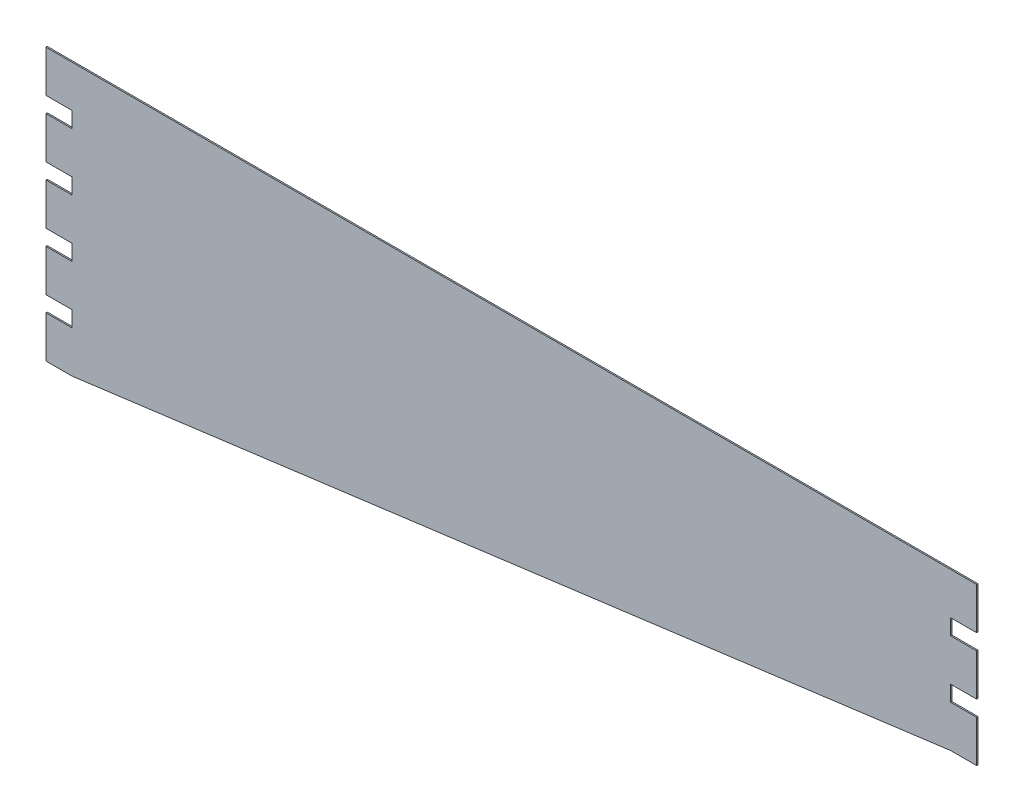
ISO-10303-21;
HEADER;
FILE_DESCRIPTION(('STEP AP214'),'2;1');
FILE_NAME('part.step','',(''),(''),'','','');
FILE_SCHEMA(('AUTOMOTIVE_DESIGN { 1 0 10303 214 1 1 1 1 }'));
ENDSEC;
DATA;
#1=APPLICATION_CONTEXT('core data for automotive mechanical design processes');
#2=APPLICATION_PROTOCOL_DEFINITION('international standard','automotive_design',2000,#1);
#3=PRODUCT_CONTEXT('',#1,'mechanical');
#4=PRODUCT('Part','Part','',(#3));
#5=PRODUCT_RELATED_PRODUCT_CATEGORY('part','',(#4));
#6=PRODUCT_DEFINITION_FORMATION('','',#4);
#7=PRODUCT_DEFINITION_CONTEXT('part definition',#1,'design');
#8=PRODUCT_DEFINITION('design','',#6,#7);
#9=PRODUCT_DEFINITION_SHAPE('','',#8);
#10=(LENGTH_UNIT() NAMED_UNIT(*) SI_UNIT(.MILLI.,.METRE.));
#11=(NAMED_UNIT(*) PLANE_ANGLE_UNIT() SI_UNIT($,.RADIAN.));
#12=(NAMED_UNIT(*) SI_UNIT($,.STERADIAN.) SOLID_ANGLE_UNIT());
#13=UNCERTAINTY_MEASURE_WITH_UNIT(LENGTH_MEASURE(1.E-05),#10,'distance_accuracy_value','');
#14=(GEOMETRIC_REPRESENTATION_CONTEXT(3) GLOBAL_UNCERTAINTY_ASSIGNED_CONTEXT((#13)) GLOBAL_UNIT_ASSIGNED_CONTEXT((#10,
#11,#12)) REPRESENTATION_CONTEXT('',''));
#15=CARTESIAN_POINT('',(0.,0.,0.));
#16=DIRECTION('',(0.,0.,1.));
#17=DIRECTION('',(1.,0.,0.));
#18=AXIS2_PLACEMENT_3D('',#15,#16,#17);
#19=CARTESIAN_POINT('',(0.,52.,0.125));
#20=DIRECTION('',(1.,0.,0.));
#21=DIRECTION('',(0.,1.,0.));
#22=AXIS2_PLACEMENT_3D('',#19,#20,#21);
#23=PLANE('',#22);
#24=DIRECTION('',(0.,-1.,0.));
#25=VECTOR('',#24,1.);
#26=CARTESIAN_POINT('',(0.,52.,0.125));
#27=LINE('',#26,#25);
#28=CARTESIAN_POINT('',(0.,8.00000000000001,0.125));
#29=VERTEX_POINT('',#28);
#30=CARTESIAN_POINT('',(0.,0.,0.125));
#31=VERTEX_POINT('',#30);
#32=EDGE_CURVE('E400',#29,#31,#27,.T.);
#33=ORIENTED_EDGE('',*,*,#32,.F.);
#34=DIRECTION('',(0.,0.,1.));
#35=VECTOR('',#34,1.);
#36=CARTESIAN_POINT('',(0.,8.00000000000001,-0.125));
#37=LINE('',#36,#35);
#38=CARTESIAN_POINT('',(0.,8.00000000000001,-0.125));
#39=VERTEX_POINT('',#38);
#40=EDGE_CURVE('E288',#39,#29,#37,.T.);
#41=ORIENTED_EDGE('',*,*,#40,.F.);
#42=DIRECTION('',(0.,-1.,0.));
#43=VECTOR('',#42,1.);
#44=CARTESIAN_POINT('',(0.,52.,-0.125));
#45=LINE('',#44,#43);
#46=CARTESIAN_POINT('',(0.,0.,-0.125));
#47=VERTEX_POINT('',#46);
#48=EDGE_CURVE('E389',#39,#47,#45,.T.);
#49=ORIENTED_EDGE('',*,*,#48,.T.);
#50=DIRECTION('',(0.,0.,-1.));
#51=VECTOR('',#50,1.);
#52=CARTESIAN_POINT('',(0.,0.,0.125));
#53=LINE('',#52,#51);
#54=EDGE_CURVE('E11',#31,#47,#53,.T.);
#55=ORIENTED_EDGE('',*,*,#54,.F.);
#56=EDGE_LOOP('',(#33,#41,#49,#55));
#57=FACE_BOUND('',#56,.T.);
#58=ADVANCED_FACE('F32',(#57),#23,.F.);
#59=CARTESIAN_POINT('',(0.,19.,-0.125));
#60=VERTEX_POINT('',#59);
#61=CARTESIAN_POINT('',(0.,11.,-0.125));
#62=VERTEX_POINT('',#61);
#63=EDGE_CURVE('E470',#60,#62,#45,.T.);
#64=ORIENTED_EDGE('',*,*,#63,.T.);
#65=DIRECTION('',(0.,0.,1.));
#66=VECTOR('',#65,1.);
#67=CARTESIAN_POINT('',(0.,11.,-0.125));
#68=LINE('',#67,#66);
#69=CARTESIAN_POINT('',(0.,11.,0.125));
#70=VERTEX_POINT('',#69);
#71=EDGE_CURVE('E55',#62,#70,#68,.T.);
#72=ORIENTED_EDGE('',*,*,#71,.T.);
#73=CARTESIAN_POINT('',(0.,19.,0.125));
#74=VERTEX_POINT('',#73);
#75=EDGE_CURVE('E495',#74,#70,#27,.T.);
#76=ORIENTED_EDGE('',*,*,#75,.F.);
#77=DIRECTION('',(0.,0.,1.));
#78=VECTOR('',#77,1.);
#79=CARTESIAN_POINT('',(0.,19.,-0.125));
#80=LINE('',#79,#78);
#81=EDGE_CURVE('E267',#60,#74,#80,.T.);
#82=ORIENTED_EDGE('',*,*,#81,.F.);
#83=EDGE_LOOP('',(#64,#72,#76,#82));
#84=FACE_BOUND('',#83,.T.);
#85=ADVANCED_FACE('F502',(#84),#23,.F.);
#86=CARTESIAN_POINT('',(0.,30.,-0.125));
#87=VERTEX_POINT('',#86);
#88=CARTESIAN_POINT('',(0.,22.,-0.125));
#89=VERTEX_POINT('',#88);
#90=EDGE_CURVE('E472',#87,#89,#45,.T.);
#91=ORIENTED_EDGE('',*,*,#90,.T.);
#92=DIRECTION('',(0.,0.,1.));
#93=VECTOR('',#92,1.);
#94=CARTESIAN_POINT('',(0.,22.,-0.125));
#95=LINE('',#94,#93);
#96=CARTESIAN_POINT('',(0.,22.,0.125));
#97=VERTEX_POINT('',#96);
#98=EDGE_CURVE('E240',#89,#97,#95,.T.);
#99=ORIENTED_EDGE('',*,*,#98,.T.);
#100=CARTESIAN_POINT('',(0.,30.,0.125));
#101=VERTEX_POINT('',#100);
#102=EDGE_CURVE('E493',#101,#97,#27,.T.);
#103=ORIENTED_EDGE('',*,*,#102,.F.);
#104=DIRECTION('',(0.,0.,1.));
#105=VECTOR('',#104,1.);
#106=CARTESIAN_POINT('',(0.,30.,-0.125));
#107=LINE('',#106,#105);
#108=EDGE_CURVE('E312',#87,#101,#107,.T.);
#109=ORIENTED_EDGE('',*,*,#108,.F.);
#110=EDGE_LOOP('',(#91,#99,#103,#109));
#111=FACE_BOUND('',#110,.T.);
#112=ADVANCED_FACE('F523',(#111),#23,.F.);
#113=CARTESIAN_POINT('',(178.,22.,0.125));
#114=DIRECTION('',(-1.,0.,0.));
#115=DIRECTION('',(0.,0.,1.));
#116=AXIS2_PLACEMENT_3D('',#113,#114,#115);
#117=PLANE('',#116);
#118=DIRECTION('',(0.,1.,0.));
#119=VECTOR('',#118,1.);
#120=CARTESIAN_POINT('',(178.,22.,-0.125));
#121=LINE('',#120,#119);
#122=CARTESIAN_POINT('',(178.,22.,-0.125));
#123=VERTEX_POINT('',#122);
#124=CARTESIAN_POINT('',(178.,30.,-0.125));
#125=VERTEX_POINT('',#124);
#126=EDGE_CURVE('E425',#123,#125,#121,.T.);
#127=ORIENTED_EDGE('',*,*,#126,.T.);
#128=DIRECTION('',(0.,0.,1.));
#129=VECTOR('',#128,1.);
#130=CARTESIAN_POINT('',(178.,30.,-0.125));
#131=LINE('',#130,#129);
#132=CARTESIAN_POINT('',(178.,30.,0.125));
#133=VERTEX_POINT('',#132);
#134=EDGE_CURVE('E333',#125,#133,#131,.T.);
#135=ORIENTED_EDGE('',*,*,#134,.T.);
#136=DIRECTION('',(0.,1.,0.));
#137=VECTOR('',#136,1.);
#138=CARTESIAN_POINT('',(178.,22.,0.125));
#139=LINE('',#138,#137);
#140=CARTESIAN_POINT('',(178.,22.,0.125));
#141=VERTEX_POINT('',#140);
#142=EDGE_CURVE('E407',#141,#133,#139,.T.);
#143=ORIENTED_EDGE('',*,*,#142,.F.);
#144=DIRECTION('',(0.,0.,-1.));
#145=VECTOR('',#144,1.);
#146=CARTESIAN_POINT('',(178.,22.,0.125));
#147=LINE('',#146,#145);
#148=EDGE_CURVE('E436',#141,#123,#147,.T.);
#149=ORIENTED_EDGE('',*,*,#148,.T.);
#150=EDGE_LOOP('',(#127,#135,#143,#149));
#151=FACE_BOUND('',#150,.T.);
#152=ADVANCED_FACE('F459',(#151),#117,.F.);
#153=CARTESIAN_POINT('',(0.,41.,-0.125));
#154=VERTEX_POINT('',#153);
#155=CARTESIAN_POINT('',(0.,33.,-0.125));
#156=VERTEX_POINT('',#155);
#157=EDGE_CURVE('E418',#154,#156,#45,.T.);
#158=ORIENTED_EDGE('',*,*,#157,.T.);
#159=DIRECTION('',(0.,0.,1.));
#160=VECTOR('',#159,1.);
#161=CARTESIAN_POINT('',(0.,33.,-0.125));
#162=LINE('',#161,#160);
#163=CARTESIAN_POINT('',(0.,33.,0.125));
#164=VERTEX_POINT('',#163);
#165=EDGE_CURVE('E314',#156,#164,#162,.T.);
#166=ORIENTED_EDGE('',*,*,#165,.T.);
#167=CARTESIAN_POINT('',(0.,41.,0.125));
#168=VERTEX_POINT('',#167);
#169=EDGE_CURVE('E399',#168,#164,#27,.T.);
#170=ORIENTED_EDGE('',*,*,#169,.F.);
#171=DIRECTION('',(0.,0.,1.));
#172=VECTOR('',#171,1.);
#173=CARTESIAN_POINT('',(0.,41.,-0.125));
#174=LINE('',#173,#172);
#175=EDGE_CURVE('E362',#154,#168,#174,.T.);
#176=ORIENTED_EDGE('',*,*,#175,.F.);
#177=EDGE_LOOP('',(#158,#166,#170,#176));
#178=FACE_BOUND('',#177,.T.);
#179=ADVANCED_FACE('F481',(#178),#23,.F.);
#180=CARTESIAN_POINT('',(178.,33.,0.125));
#181=VERTEX_POINT('',#180);
#182=CARTESIAN_POINT('',(178.,41.,0.125));
#183=VERTEX_POINT('',#182);
#184=EDGE_CURVE('E411',#181,#183,#139,.T.);
#185=ORIENTED_EDGE('',*,*,#184,.F.);
#186=DIRECTION('',(0.,0.,1.));
#187=VECTOR('',#186,1.);
#188=CARTESIAN_POINT('',(178.,33.,-0.125));
#189=LINE('',#188,#187);
#190=CARTESIAN_POINT('',(178.,33.,-0.125));
#191=VERTEX_POINT('',#190);
#192=EDGE_CURVE('E326',#191,#181,#189,.T.);
#193=ORIENTED_EDGE('',*,*,#192,.F.);
#194=CARTESIAN_POINT('',(178.,41.,-0.125));
#195=VERTEX_POINT('',#194);
#196=EDGE_CURVE('E429',#191,#195,#121,.T.);
#197=ORIENTED_EDGE('',*,*,#196,.T.);
#198=DIRECTION('',(0.,0.,1.));
#199=VECTOR('',#198,1.);
#200=CARTESIAN_POINT('',(178.,41.,-0.125));
#201=LINE('',#200,#199);
#202=EDGE_CURVE('E386',#195,#183,#201,.T.);
#203=ORIENTED_EDGE('',*,*,#202,.T.);
#204=EDGE_LOOP('',(#185,#193,#197,#203));
#205=FACE_BOUND('',#204,.T.);
#206=ADVANCED_FACE('F525',(#205),#117,.F.);
#207=CARTESIAN_POINT('',(0.,52.,-0.125));
#208=VERTEX_POINT('',#207);
#209=CARTESIAN_POINT('',(0.,44.,-0.125));
#210=VERTEX_POINT('',#209);
#211=EDGE_CURVE('E414',#208,#210,#45,.T.);
#212=ORIENTED_EDGE('',*,*,#211,.T.);
#213=DIRECTION('',(0.,0.,1.));
#214=VECTOR('',#213,1.);
#215=CARTESIAN_POINT('',(0.,44.,-0.125));
#216=LINE('',#215,#214);
#217=CARTESIAN_POINT('',(0.,44.,0.125));
#218=VERTEX_POINT('',#217);
#219=EDGE_CURVE('E364',#210,#218,#216,.T.);
#220=ORIENTED_EDGE('',*,*,#219,.T.);
#221=CARTESIAN_POINT('',(0.,52.,0.125));
#222=VERTEX_POINT('',#221);
#223=EDGE_CURVE('E395',#222,#218,#27,.T.);
#224=ORIENTED_EDGE('',*,*,#223,.F.);
#225=DIRECTION('',(0.,0.,-1.));
#226=VECTOR('',#225,1.);
#227=CARTESIAN_POINT('',(0.,52.,0.125));
#228=LINE('',#227,#226);
#229=EDGE_CURVE('E413',#222,#208,#228,.T.);
#230=ORIENTED_EDGE('',*,*,#229,.T.);
#231=EDGE_LOOP('',(#212,#220,#224,#230));
#232=FACE_BOUND('',#231,.T.);
#233=ADVANCED_FACE('F34',(#232),#23,.F.);
#234=CARTESIAN_POINT('',(0.,0.,0.125));
#235=DIRECTION('',(0.,1.,0.));
#236=DIRECTION('',(-1.,0.,0.));
#237=AXIS2_PLACEMENT_3D('',#234,#235,#236);
#238=PLANE('',#237);
#239=DIRECTION('',(1.,0.,0.));
#240=VECTOR('',#239,1.);
#241=CARTESIAN_POINT('',(0.,0.,-0.125));
#242=LINE('',#241,#240);
#243=CARTESIAN_POINT('',(5.00000000000001,0.,-0.125));
#244=VERTEX_POINT('',#243);
#245=EDGE_CURVE('E417',#47,#244,#242,.T.);
#246=ORIENTED_EDGE('',*,*,#245,.T.);
#247=DIRECTION('',(0.,0.,-1.));
#248=VECTOR('',#247,1.);
#249=CARTESIAN_POINT('',(5.00000000000001,0.,0.125));
#250=LINE('',#249,#248);
#251=CARTESIAN_POINT('',(5.00000000000001,0.,0.125));
#252=VERTEX_POINT('',#251);
#253=EDGE_CURVE('E40',#252,#244,#250,.T.);
#254=ORIENTED_EDGE('',*,*,#253,.F.);
#255=DIRECTION('',(1.,0.,0.));
#256=VECTOR('',#255,1.);
#257=CARTESIAN_POINT('',(0.,0.,0.125));
#258=LINE('',#257,#256);
#259=EDGE_CURVE('E398',#31,#252,#258,.T.);
#260=ORIENTED_EDGE('',*,*,#259,.F.);
#261=ORIENTED_EDGE('',*,*,#54,.T.);
#262=EDGE_LOOP('',(#246,#254,#260,#261));
#263=FACE_BOUND('',#262,.T.);
#264=ADVANCED_FACE('F467',(#263),#238,.F.);
#265=CARTESIAN_POINT('',(5.00000000000001,0.,0.125));
#266=DIRECTION('',(-0.129843798506472,0.991534461322152,0.));
#267=DIRECTION('',(-0.991534461322152,-0.129843798506472,0.));
#268=AXIS2_PLACEMENT_3D('',#265,#266,#267);
#269=PLANE('',#268);
#270=DIRECTION('',(0.991534461322152,0.129843798506472,0.));
#271=VECTOR('',#270,1.);
#272=CARTESIAN_POINT('',(5.00000000000001,0.,-0.125));
#273=LINE('',#272,#271);
#274=CARTESIAN_POINT('',(173.,22.,-0.125));
#275=VERTEX_POINT('',#274);
#276=EDGE_CURVE('E420',#244,#275,#273,.T.);
#277=ORIENTED_EDGE('',*,*,#276,.T.);
#278=DIRECTION('',(0.,0.,-1.));
#279=VECTOR('',#278,1.);
#280=CARTESIAN_POINT('',(173.,22.,0.125));
#281=LINE('',#280,#279);
#282=CARTESIAN_POINT('',(173.,22.,0.125));
#283=VERTEX_POINT('',#282);
#284=EDGE_CURVE('E439',#283,#275,#281,.T.);
#285=ORIENTED_EDGE('',*,*,#284,.F.);
#286=DIRECTION('',(0.991534461322152,0.129843798506472,0.));
#287=VECTOR('',#286,1.);
#288=CARTESIAN_POINT('',(5.00000000000001,0.,0.125));
#289=LINE('',#288,#287);
#290=EDGE_CURVE('E402',#252,#283,#289,.T.);
#291=ORIENTED_EDGE('',*,*,#290,.F.);
#292=ORIENTED_EDGE('',*,*,#253,.T.);
#293=EDGE_LOOP('',(#277,#285,#291,#292));
#294=FACE_BOUND('',#293,.T.);
#295=ADVANCED_FACE('F446',(#294),#269,.F.);
#296=CARTESIAN_POINT('',(173.,22.,0.125));
#297=DIRECTION('',(0.,1.,0.));
#298=DIRECTION('',(0.,0.,1.));
#299=AXIS2_PLACEMENT_3D('',#296,#297,#298);
#300=PLANE('',#299);
#301=DIRECTION('',(1.,0.,0.));
#302=VECTOR('',#301,1.);
#303=CARTESIAN_POINT('',(173.,22.,-0.125));
#304=LINE('',#303,#302);
#305=EDGE_CURVE('E422',#275,#123,#304,.T.);
#306=ORIENTED_EDGE('',*,*,#305,.T.);
#307=ORIENTED_EDGE('',*,*,#148,.F.);
#308=DIRECTION('',(1.,0.,0.));
#309=VECTOR('',#308,1.);
#310=CARTESIAN_POINT('',(173.,22.,0.125));
#311=LINE('',#310,#309);
#312=EDGE_CURVE('E404',#283,#141,#311,.T.);
#313=ORIENTED_EDGE('',*,*,#312,.F.);
#314=ORIENTED_EDGE('',*,*,#284,.T.);
#315=EDGE_LOOP('',(#306,#307,#313,#314));
#316=FACE_BOUND('',#315,.T.);
#317=ADVANCED_FACE('F455',(#316),#300,.F.);
#318=CARTESIAN_POINT('',(178.,44.,0.125));
#319=VERTEX_POINT('',#318);
#320=CARTESIAN_POINT('',(178.,52.,0.125));
#321=VERTEX_POINT('',#320);
#322=EDGE_CURVE('E406',#319,#321,#139,.T.);
#323=ORIENTED_EDGE('',*,*,#322,.F.);
#324=DIRECTION('',(0.,0.,1.));
#325=VECTOR('',#324,1.);
#326=CARTESIAN_POINT('',(178.,44.,-0.125));
#327=LINE('',#326,#325);
#328=CARTESIAN_POINT('',(178.,44.,-0.125));
#329=VERTEX_POINT('',#328);
#330=EDGE_CURVE('E378',#329,#319,#327,.T.);
#331=ORIENTED_EDGE('',*,*,#330,.F.);
#332=CARTESIAN_POINT('',(178.,52.,-0.125));
#333=VERTEX_POINT('',#332);
#334=EDGE_CURVE('E424',#329,#333,#121,.T.);
#335=ORIENTED_EDGE('',*,*,#334,.T.);
#336=DIRECTION('',(0.,0.,-1.));
#337=VECTOR('',#336,1.);
#338=CARTESIAN_POINT('',(178.,52.,0.125));
#339=LINE('',#338,#337);
#340=EDGE_CURVE('E433',#321,#333,#339,.T.);
#341=ORIENTED_EDGE('',*,*,#340,.F.);
#342=EDGE_LOOP('',(#323,#331,#335,#341));
#343=FACE_BOUND('',#342,.T.);
#344=ADVANCED_FACE('F533',(#343),#117,.F.);
#345=CARTESIAN_POINT('',(178.,52.,0.125));
#346=DIRECTION('',(0.,-1.,0.));
#347=DIRECTION('',(1.,0.,0.));
#348=AXIS2_PLACEMENT_3D('',#345,#346,#347);
#349=PLANE('',#348);
#350=DIRECTION('',(-1.,0.,0.));
#351=VECTOR('',#350,1.);
#352=CARTESIAN_POINT('',(178.,52.,-0.125));
#353=LINE('',#352,#351);
#354=EDGE_CURVE('E428',#333,#208,#353,.T.);
#355=ORIENTED_EDGE('',*,*,#354,.T.);
#356=ORIENTED_EDGE('',*,*,#229,.F.);
#357=DIRECTION('',(-1.,0.,0.));
#358=VECTOR('',#357,1.);
#359=CARTESIAN_POINT('',(178.,52.,0.125));
#360=LINE('',#359,#358);
#361=EDGE_CURVE('E410',#321,#222,#360,.T.);
#362=ORIENTED_EDGE('',*,*,#361,.F.);
#363=ORIENTED_EDGE('',*,*,#340,.T.);
#364=EDGE_LOOP('',(#355,#356,#362,#363));
#365=FACE_BOUND('',#364,.T.);
#366=ADVANCED_FACE('F574',(#365),#349,.F.);
#367=CARTESIAN_POINT('',(0.,0.,0.125));
#368=DIRECTION('',(0.,0.,1.));
#369=DIRECTION('',(1.,0.,0.));
#370=AXIS2_PLACEMENT_3D('',#367,#368,#369);
#371=PLANE('',#370);
#372=DIRECTION('',(1.,0.,0.));
#373=VECTOR('',#372,1.);
#374=CARTESIAN_POINT('',(5.00000000000003,8.00000000000001,0.125));
#375=LINE('',#374,#373);
#376=CARTESIAN_POINT('',(5.00000000000003,8.00000000000001,0.125));
#377=VERTEX_POINT('',#376);
#378=EDGE_CURVE('E274',#29,#377,#375,.T.);
#379=ORIENTED_EDGE('',*,*,#378,.F.);
#380=ORIENTED_EDGE('',*,*,#32,.T.);
#381=ORIENTED_EDGE('',*,*,#259,.T.);
#382=ORIENTED_EDGE('',*,*,#290,.T.);
#383=ORIENTED_EDGE('',*,*,#312,.T.);
#384=ORIENTED_EDGE('',*,*,#142,.T.);
#385=DIRECTION('',(1.,0.,0.));
#386=VECTOR('',#385,1.);
#387=CARTESIAN_POINT('',(178.,30.,0.125));
#388=LINE('',#387,#386);
#389=CARTESIAN_POINT('',(173.,30.,0.125));
#390=VERTEX_POINT('',#389);
#391=EDGE_CURVE('E321',#390,#133,#388,.T.);
#392=ORIENTED_EDGE('',*,*,#391,.F.);
#393=DIRECTION('',(0.,-1.,0.));
#394=VECTOR('',#393,1.);
#395=CARTESIAN_POINT('',(173.,33.,0.125));
#396=LINE('',#395,#394);
#397=CARTESIAN_POINT('',(173.,33.,0.125));
#398=VERTEX_POINT('',#397);
#399=EDGE_CURVE('E329',#398,#390,#396,.T.);
#400=ORIENTED_EDGE('',*,*,#399,.F.);
#401=DIRECTION('',(-1.,0.,0.));
#402=VECTOR('',#401,1.);
#403=CARTESIAN_POINT('',(178.,33.,0.125));
#404=LINE('',#403,#402);
#405=EDGE_CURVE('E311',#181,#398,#404,.T.);
#406=ORIENTED_EDGE('',*,*,#405,.F.);
#407=ORIENTED_EDGE('',*,*,#184,.T.);
#408=DIRECTION('',(1.,0.,0.));
#409=VECTOR('',#408,1.);
#410=CARTESIAN_POINT('',(178.,41.,0.125));
#411=LINE('',#410,#409);
#412=CARTESIAN_POINT('',(173.,41.,0.125));
#413=VERTEX_POINT('',#412);
#414=EDGE_CURVE('E372',#413,#183,#411,.T.);
#415=ORIENTED_EDGE('',*,*,#414,.F.);
#416=DIRECTION('',(0.,-1.,0.));
#417=VECTOR('',#416,1.);
#418=CARTESIAN_POINT('',(173.,44.,0.125));
#419=LINE('',#418,#417);
#420=CARTESIAN_POINT('',(173.,44.,0.125));
#421=VERTEX_POINT('',#420);
#422=EDGE_CURVE('E381',#421,#413,#419,.T.);
#423=ORIENTED_EDGE('',*,*,#422,.F.);
#424=DIRECTION('',(-1.,0.,0.));
#425=VECTOR('',#424,1.);
#426=CARTESIAN_POINT('',(178.,44.,0.125));
#427=LINE('',#426,#425);
#428=EDGE_CURVE('E361',#319,#421,#427,.T.);
#429=ORIENTED_EDGE('',*,*,#428,.F.);
#430=ORIENTED_EDGE('',*,*,#322,.T.);
#431=ORIENTED_EDGE('',*,*,#361,.T.);
#432=ORIENTED_EDGE('',*,*,#223,.T.);
#433=DIRECTION('',(-1.,0.,0.));
#434=VECTOR('',#433,1.);
#435=CARTESIAN_POINT('',(5.00000000000003,44.,0.125));
#436=LINE('',#435,#434);
#437=CARTESIAN_POINT('',(5.00000000000003,44.,0.125));
#438=VERTEX_POINT('',#437);
#439=EDGE_CURVE('E355',#438,#218,#436,.T.);
#440=ORIENTED_EDGE('',*,*,#439,.F.);
#441=DIRECTION('',(0.,1.,0.));
#442=VECTOR('',#441,1.);
#443=CARTESIAN_POINT('',(5.00000000000003,44.,0.125));
#444=LINE('',#443,#442);
#445=CARTESIAN_POINT('',(5.00000000000003,41.,0.125));
#446=VERTEX_POINT('',#445);
#447=EDGE_CURVE('E336',#446,#438,#444,.T.);
#448=ORIENTED_EDGE('',*,*,#447,.F.);
#449=DIRECTION('',(1.,0.,0.));
#450=VECTOR('',#449,1.);
#451=CARTESIAN_POINT('',(5.00000000000003,41.,0.125));
#452=LINE('',#451,#450);
#453=EDGE_CURVE('E346',#168,#446,#452,.T.);
#454=ORIENTED_EDGE('',*,*,#453,.F.);
#455=ORIENTED_EDGE('',*,*,#169,.T.);
#456=DIRECTION('',(-1.,0.,0.));
#457=VECTOR('',#456,1.);
#458=CARTESIAN_POINT('',(5.00000000000003,33.,0.125));
#459=LINE('',#458,#457);
#460=CARTESIAN_POINT('',(5.00000000000003,33.,0.125));
#461=VERTEX_POINT('',#460);
#462=EDGE_CURVE('E305',#461,#164,#459,.T.);
#463=ORIENTED_EDGE('',*,*,#462,.F.);
#464=DIRECTION('',(0.,1.,0.));
#465=VECTOR('',#464,1.);
#466=CARTESIAN_POINT('',(5.00000000000003,33.,0.125));
#467=LINE('',#466,#465);
#468=CARTESIAN_POINT('',(5.00000000000003,30.,0.125));
#469=VERTEX_POINT('',#468);
#470=EDGE_CURVE('E266',#469,#461,#467,.T.);
#471=ORIENTED_EDGE('',*,*,#470,.F.);
#472=DIRECTION('',(1.,0.,0.));
#473=VECTOR('',#472,1.);
#474=CARTESIAN_POINT('',(5.00000000000003,30.,0.125));
#475=LINE('',#474,#473);
#476=EDGE_CURVE('E296',#101,#469,#475,.T.);
#477=ORIENTED_EDGE('',*,*,#476,.F.);
#478=ORIENTED_EDGE('',*,*,#102,.T.);
#479=DIRECTION('',(-1.,0.,0.));
#480=VECTOR('',#479,1.);
#481=CARTESIAN_POINT('',(5.00000000000003,22.,0.125));
#482=LINE('',#481,#480);
#483=CARTESIAN_POINT('',(5.00000000000003,22.,0.125));
#484=VERTEX_POINT('',#483);
#485=EDGE_CURVE('E257',#484,#97,#482,.T.);
#486=ORIENTED_EDGE('',*,*,#485,.F.);
#487=DIRECTION('',(0.,1.,0.));
#488=VECTOR('',#487,1.);
#489=CARTESIAN_POINT('',(5.00000000000003,22.,0.125));
#490=LINE('',#489,#488);
#491=CARTESIAN_POINT('',(5.00000000000003,19.,0.125));
#492=VERTEX_POINT('',#491);
#493=EDGE_CURVE('E237',#492,#484,#490,.T.);
#494=ORIENTED_EDGE('',*,*,#493,.F.);
#495=DIRECTION('',(1.,0.,0.));
#496=VECTOR('',#495,1.);
#497=CARTESIAN_POINT('',(5.00000000000003,19.,0.125));
#498=LINE('',#497,#496);
#499=EDGE_CURVE('E254',#74,#492,#498,.T.);
#500=ORIENTED_EDGE('',*,*,#499,.F.);
#501=ORIENTED_EDGE('',*,*,#75,.T.);
#502=DIRECTION('',(-1.,0.,0.));
#503=VECTOR('',#502,1.);
#504=CARTESIAN_POINT('',(5.00000000000003,11.,0.125));
#505=LINE('',#504,#503);
#506=CARTESIAN_POINT('',(5.00000000000003,11.,0.125));
#507=VERTEX_POINT('',#506);
#508=EDGE_CURVE('E283',#507,#70,#505,.T.);
#509=ORIENTED_EDGE('',*,*,#508,.F.);
#510=DIRECTION('',(0.,1.,0.));
#511=VECTOR('',#510,1.);
#512=CARTESIAN_POINT('',(5.00000000000003,11.,0.125));
#513=LINE('',#512,#511);
#514=EDGE_CURVE('E280',#377,#507,#513,.T.);
#515=ORIENTED_EDGE('',*,*,#514,.F.);
#516=EDGE_LOOP('',(#379,#380,#381,#382,#383,#384,#392,#400,#406,#407,#415,#423,#429,#430,#431,
#432,#440,#448,#454,#455,#463,#471,#477,#478,#486,#494,#500,#501,#509,#515));
#517=FACE_BOUND('',#516,.T.);
#518=ADVANCED_FACE('F463',(#517),#371,.T.);
#519=CARTESIAN_POINT('',(0.,0.,-0.125));
#520=DIRECTION('',(0.,0.,1.));
#521=DIRECTION('',(1.,0.,0.));
#522=AXIS2_PLACEMENT_3D('',#519,#520,#521);
#523=PLANE('',#522);
#524=ORIENTED_EDGE('',*,*,#48,.F.);
#525=DIRECTION('',(1.,0.,0.));
#526=VECTOR('',#525,1.);
#527=CARTESIAN_POINT('',(5.00000000000003,8.00000000000001,-0.125));
#528=LINE('',#527,#526);
#529=CARTESIAN_POINT('',(5.00000000000003,8.00000000000001,-0.125));
#530=VERTEX_POINT('',#529);
#531=EDGE_CURVE('E276',#39,#530,#528,.T.);
#532=ORIENTED_EDGE('',*,*,#531,.T.);
#533=DIRECTION('',(0.,1.,0.));
#534=VECTOR('',#533,1.);
#535=CARTESIAN_POINT('',(5.00000000000003,11.,-0.125));
#536=LINE('',#535,#534);
#537=CARTESIAN_POINT('',(5.00000000000003,11.,-0.125));
#538=VERTEX_POINT('',#537);
#539=EDGE_CURVE('E270',#530,#538,#536,.T.);
#540=ORIENTED_EDGE('',*,*,#539,.T.);
#541=DIRECTION('',(-1.,0.,0.));
#542=VECTOR('',#541,1.);
#543=CARTESIAN_POINT('',(5.00000000000003,11.,-0.125));
#544=LINE('',#543,#542);
#545=EDGE_CURVE('E273',#538,#62,#544,.T.);
#546=ORIENTED_EDGE('',*,*,#545,.T.);
#547=ORIENTED_EDGE('',*,*,#63,.F.);
#548=DIRECTION('',(1.,0.,0.));
#549=VECTOR('',#548,1.);
#550=CARTESIAN_POINT('',(5.00000000000003,19.,-0.125));
#551=LINE('',#550,#549);
#552=CARTESIAN_POINT('',(5.00000000000003,19.,-0.125));
#553=VERTEX_POINT('',#552);
#554=EDGE_CURVE('E241',#60,#553,#551,.T.);
#555=ORIENTED_EDGE('',*,*,#554,.T.);
#556=DIRECTION('',(0.,1.,0.));
#557=VECTOR('',#556,1.);
#558=CARTESIAN_POINT('',(5.00000000000003,22.,-0.125));
#559=LINE('',#558,#557);
#560=CARTESIAN_POINT('',(5.00000000000003,22.,-0.125));
#561=VERTEX_POINT('',#560);
#562=EDGE_CURVE('E234',#553,#561,#559,.T.);
#563=ORIENTED_EDGE('',*,*,#562,.T.);
#564=DIRECTION('',(-1.,0.,0.));
#565=VECTOR('',#564,1.);
#566=CARTESIAN_POINT('',(5.00000000000003,22.,-0.125));
#567=LINE('',#566,#565);
#568=EDGE_CURVE('E244',#561,#89,#567,.T.);
#569=ORIENTED_EDGE('',*,*,#568,.T.);
#570=ORIENTED_EDGE('',*,*,#90,.F.);
#571=DIRECTION('',(1.,0.,0.));
#572=VECTOR('',#571,1.);
#573=CARTESIAN_POINT('',(5.00000000000003,30.,-0.125));
#574=LINE('',#573,#572);
#575=CARTESIAN_POINT('',(5.00000000000003,30.,-0.125));
#576=VERTEX_POINT('',#575);
#577=EDGE_CURVE('E299',#87,#576,#574,.T.);
#578=ORIENTED_EDGE('',*,*,#577,.T.);
#579=DIRECTION('',(0.,1.,0.));
#580=VECTOR('',#579,1.);
#581=CARTESIAN_POINT('',(5.00000000000003,33.,-0.125));
#582=LINE('',#581,#580);
#583=CARTESIAN_POINT('',(5.00000000000003,33.,-0.125));
#584=VERTEX_POINT('',#583);
#585=EDGE_CURVE('E292',#576,#584,#582,.T.);
#586=ORIENTED_EDGE('',*,*,#585,.T.);
#587=DIRECTION('',(-1.,0.,0.));
#588=VECTOR('',#587,1.);
#589=CARTESIAN_POINT('',(5.00000000000003,33.,-0.125));
#590=LINE('',#589,#588);
#591=EDGE_CURVE('E295',#584,#156,#590,.T.);
#592=ORIENTED_EDGE('',*,*,#591,.T.);
#593=ORIENTED_EDGE('',*,*,#157,.F.);
#594=DIRECTION('',(1.,0.,0.));
#595=VECTOR('',#594,1.);
#596=CARTESIAN_POINT('',(5.00000000000003,41.,-0.125));
#597=LINE('',#596,#595);
#598=CARTESIAN_POINT('',(5.00000000000003,41.,-0.125));
#599=VERTEX_POINT('',#598);
#600=EDGE_CURVE('E349',#154,#599,#597,.T.);
#601=ORIENTED_EDGE('',*,*,#600,.T.);
#602=DIRECTION('',(0.,1.,0.));
#603=VECTOR('',#602,1.);
#604=CARTESIAN_POINT('',(5.00000000000003,44.,-0.125));
#605=LINE('',#604,#603);
#606=CARTESIAN_POINT('',(5.00000000000003,44.,-0.125));
#607=VERTEX_POINT('',#606);
#608=EDGE_CURVE('E342',#599,#607,#605,.T.);
#609=ORIENTED_EDGE('',*,*,#608,.T.);
#610=DIRECTION('',(-1.,0.,0.));
#611=VECTOR('',#610,1.);
#612=CARTESIAN_POINT('',(5.00000000000003,44.,-0.125));
#613=LINE('',#612,#611);
#614=EDGE_CURVE('E345',#607,#210,#613,.T.);
#615=ORIENTED_EDGE('',*,*,#614,.T.);
#616=ORIENTED_EDGE('',*,*,#211,.F.);
#617=ORIENTED_EDGE('',*,*,#354,.F.);
#618=ORIENTED_EDGE('',*,*,#334,.F.);
#619=DIRECTION('',(-1.,0.,0.));
#620=VECTOR('',#619,1.);
#621=CARTESIAN_POINT('',(178.,44.,-0.125));
#622=LINE('',#621,#620);
#623=CARTESIAN_POINT('',(173.,44.,-0.125));
#624=VERTEX_POINT('',#623);
#625=EDGE_CURVE('E368',#329,#624,#622,.T.);
#626=ORIENTED_EDGE('',*,*,#625,.T.);
#627=DIRECTION('',(0.,-1.,0.));
#628=VECTOR('',#627,1.);
#629=CARTESIAN_POINT('',(173.,44.,-0.125));
#630=LINE('',#629,#628);
#631=CARTESIAN_POINT('',(173.,41.,-0.125));
#632=VERTEX_POINT('',#631);
#633=EDGE_CURVE('E371',#624,#632,#630,.T.);
#634=ORIENTED_EDGE('',*,*,#633,.T.);
#635=DIRECTION('',(1.,0.,0.));
#636=VECTOR('',#635,1.);
#637=CARTESIAN_POINT('',(178.,41.,-0.125));
#638=LINE('',#637,#636);
#639=EDGE_CURVE('E375',#632,#195,#638,.T.);
#640=ORIENTED_EDGE('',*,*,#639,.T.);
#641=ORIENTED_EDGE('',*,*,#196,.F.);
#642=DIRECTION('',(-1.,0.,0.));
#643=VECTOR('',#642,1.);
#644=CARTESIAN_POINT('',(178.,33.,-0.125));
#645=LINE('',#644,#643);
#646=CARTESIAN_POINT('',(173.,33.,-0.125));
#647=VERTEX_POINT('',#646);
#648=EDGE_CURVE('E318',#191,#647,#645,.T.);
#649=ORIENTED_EDGE('',*,*,#648,.T.);
#650=DIRECTION('',(0.,-1.,0.));
#651=VECTOR('',#650,1.);
#652=CARTESIAN_POINT('',(173.,33.,-0.125));
#653=LINE('',#652,#651);
#654=CARTESIAN_POINT('',(173.,30.,-0.125));
#655=VERTEX_POINT('',#654);
#656=EDGE_CURVE('E47',#647,#655,#653,.T.);
#657=ORIENTED_EDGE('',*,*,#656,.T.);
#658=DIRECTION('',(1.,0.,0.));
#659=VECTOR('',#658,1.);
#660=CARTESIAN_POINT('',(178.,30.,-0.125));
#661=LINE('',#660,#659);
#662=EDGE_CURVE('E323',#655,#125,#661,.T.);
#663=ORIENTED_EDGE('',*,*,#662,.T.);
#664=ORIENTED_EDGE('',*,*,#126,.F.);
#665=ORIENTED_EDGE('',*,*,#305,.F.);
#666=ORIENTED_EDGE('',*,*,#276,.F.);
#667=ORIENTED_EDGE('',*,*,#245,.F.);
#668=EDGE_LOOP('',(#524,#532,#540,#546,#547,#555,#563,#569,#570,#578,#586,#592,#593,#601,#609,
#615,#616,#617,#618,#626,#634,#640,#641,#649,#657,#663,#664,#665,#666,#667));
#669=FACE_BOUND('',#668,.T.);
#670=ADVANCED_FACE('F252',(#669),#523,.F.);
#671=CARTESIAN_POINT('',(178.,41.,-0.125));
#672=DIRECTION('',(0.,-1.,0.));
#673=DIRECTION('',(0.,0.,-1.));
#674=AXIS2_PLACEMENT_3D('',#671,#672,#673);
#675=PLANE('',#674);
#676=ORIENTED_EDGE('',*,*,#414,.T.);
#677=ORIENTED_EDGE('',*,*,#202,.F.);
#678=ORIENTED_EDGE('',*,*,#639,.F.);
#679=DIRECTION('',(0.,0.,1.));
#680=VECTOR('',#679,1.);
#681=CARTESIAN_POINT('',(173.,41.,-0.125));
#682=LINE('',#681,#680);
#683=EDGE_CURVE('E390',#632,#413,#682,.T.);
#684=ORIENTED_EDGE('',*,*,#683,.T.);
#685=EDGE_LOOP('',(#676,#677,#678,#684));
#686=FACE_BOUND('',#685,.T.);
#687=ADVANCED_FACE('F584',(#686),#675,.F.);
#688=CARTESIAN_POINT('',(173.,44.,-0.125));
#689=DIRECTION('',(-1.,0.,0.));
#690=DIRECTION('',(0.,0.,1.));
#691=AXIS2_PLACEMENT_3D('',#688,#689,#690);
#692=PLANE('',#691);
#693=ORIENTED_EDGE('',*,*,#422,.T.);
#694=ORIENTED_EDGE('',*,*,#683,.F.);
#695=ORIENTED_EDGE('',*,*,#633,.F.);
#696=DIRECTION('',(0.,0.,1.));
#697=VECTOR('',#696,1.);
#698=CARTESIAN_POINT('',(173.,44.,-0.125));
#699=LINE('',#698,#697);
#700=EDGE_CURVE('E392',#624,#421,#699,.T.);
#701=ORIENTED_EDGE('',*,*,#700,.T.);
#702=EDGE_LOOP('',(#693,#694,#695,#701));
#703=FACE_BOUND('',#702,.T.);
#704=ADVANCED_FACE('F721',(#703),#692,.F.);
#705=CARTESIAN_POINT('',(178.,44.,-0.125));
#706=DIRECTION('',(0.,1.,0.));
#707=DIRECTION('',(0.,0.,1.));
#708=AXIS2_PLACEMENT_3D('',#705,#706,#707);
#709=PLANE('',#708);
#710=ORIENTED_EDGE('',*,*,#428,.T.);
#711=ORIENTED_EDGE('',*,*,#700,.F.);
#712=ORIENTED_EDGE('',*,*,#625,.F.);
#713=ORIENTED_EDGE('',*,*,#330,.T.);
#714=EDGE_LOOP('',(#710,#711,#712,#713));
#715=FACE_BOUND('',#714,.T.);
#716=ADVANCED_FACE('F596',(#715),#709,.F.);
#717=CARTESIAN_POINT('',(5.00000000000003,44.,-0.125));
#718=DIRECTION('',(1.,0.,0.));
#719=DIRECTION('',(0.,0.,-1.));
#720=AXIS2_PLACEMENT_3D('',#717,#718,#719);
#721=PLANE('',#720);
#722=ORIENTED_EDGE('',*,*,#447,.T.);
#723=DIRECTION('',(0.,0.,1.));
#724=VECTOR('',#723,1.);
#725=CARTESIAN_POINT('',(5.00000000000003,44.,-0.125));
#726=LINE('',#725,#724);
#727=EDGE_CURVE('E352',#607,#438,#726,.T.);
#728=ORIENTED_EDGE('',*,*,#727,.F.);
#729=ORIENTED_EDGE('',*,*,#608,.F.);
#730=DIRECTION('',(0.,0.,1.));
#731=VECTOR('',#730,1.);
#732=CARTESIAN_POINT('',(5.00000000000003,41.,-0.125));
#733=LINE('',#732,#731);
#734=EDGE_CURVE('E359',#599,#446,#733,.T.);
#735=ORIENTED_EDGE('',*,*,#734,.T.);
#736=EDGE_LOOP('',(#722,#728,#729,#735));
#737=FACE_BOUND('',#736,.T.);
#738=ADVANCED_FACE('F590',(#737),#721,.F.);
#739=CARTESIAN_POINT('',(5.00000000000003,41.,-0.125));
#740=DIRECTION('',(0.,-1.,0.));
#741=DIRECTION('',(0.,0.,-1.));
#742=AXIS2_PLACEMENT_3D('',#739,#740,#741);
#743=PLANE('',#742);
#744=ORIENTED_EDGE('',*,*,#453,.T.);
#745=ORIENTED_EDGE('',*,*,#734,.F.);
#746=ORIENTED_EDGE('',*,*,#600,.F.);
#747=ORIENTED_EDGE('',*,*,#175,.T.);
#748=EDGE_LOOP('',(#744,#745,#746,#747));
#749=FACE_BOUND('',#748,.T.);
#750=ADVANCED_FACE('F595',(#749),#743,.F.);
#751=CARTESIAN_POINT('',(5.00000000000003,44.,-0.125));
#752=DIRECTION('',(0.,1.,0.));
#753=DIRECTION('',(0.,0.,1.));
#754=AXIS2_PLACEMENT_3D('',#751,#752,#753);
#755=PLANE('',#754);
#756=ORIENTED_EDGE('',*,*,#439,.T.);
#757=ORIENTED_EDGE('',*,*,#219,.F.);
#758=ORIENTED_EDGE('',*,*,#614,.F.);
#759=ORIENTED_EDGE('',*,*,#727,.T.);
#760=EDGE_LOOP('',(#756,#757,#758,#759));
#761=FACE_BOUND('',#760,.T.);
#762=ADVANCED_FACE('F608',(#761),#755,.F.);
#763=CARTESIAN_POINT('',(5.00000000000003,33.,-0.125));
#764=DIRECTION('',(1.,0.,0.));
#765=DIRECTION('',(0.,0.,-1.));
#766=AXIS2_PLACEMENT_3D('',#763,#764,#765);
#767=PLANE('',#766);
#768=ORIENTED_EDGE('',*,*,#470,.T.);
#769=DIRECTION('',(0.,0.,1.));
#770=VECTOR('',#769,1.);
#771=CARTESIAN_POINT('',(5.00000000000003,33.,-0.125));
#772=LINE('',#771,#770);
#773=EDGE_CURVE('E302',#584,#461,#772,.T.);
#774=ORIENTED_EDGE('',*,*,#773,.F.);
#775=ORIENTED_EDGE('',*,*,#585,.F.);
#776=DIRECTION('',(0.,0.,1.));
#777=VECTOR('',#776,1.);
#778=CARTESIAN_POINT('',(5.00000000000003,30.,-0.125));
#779=LINE('',#778,#777);
#780=EDGE_CURVE('E309',#576,#469,#779,.T.);
#781=ORIENTED_EDGE('',*,*,#780,.T.);
#782=EDGE_LOOP('',(#768,#774,#775,#781));
#783=FACE_BOUND('',#782,.T.);
#784=ADVANCED_FACE('F618',(#783),#767,.F.);
#785=CARTESIAN_POINT('',(5.00000000000003,30.,-0.125));
#786=DIRECTION('',(0.,-1.,0.));
#787=DIRECTION('',(0.,0.,-1.));
#788=AXIS2_PLACEMENT_3D('',#785,#786,#787);
#789=PLANE('',#788);
#790=ORIENTED_EDGE('',*,*,#476,.T.);
#791=ORIENTED_EDGE('',*,*,#780,.F.);
#792=ORIENTED_EDGE('',*,*,#577,.F.);
#793=ORIENTED_EDGE('',*,*,#108,.T.);
#794=EDGE_LOOP('',(#790,#791,#792,#793));
#795=FACE_BOUND('',#794,.T.);
#796=ADVANCED_FACE('F628',(#795),#789,.F.);
#797=CARTESIAN_POINT('',(5.00000000000003,33.,-0.125));
#798=DIRECTION('',(0.,1.,0.));
#799=DIRECTION('',(0.,0.,1.));
#800=AXIS2_PLACEMENT_3D('',#797,#798,#799);
#801=PLANE('',#800);
#802=ORIENTED_EDGE('',*,*,#462,.T.);
#803=ORIENTED_EDGE('',*,*,#165,.F.);
#804=ORIENTED_EDGE('',*,*,#591,.F.);
#805=ORIENTED_EDGE('',*,*,#773,.T.);
#806=EDGE_LOOP('',(#802,#803,#804,#805));
#807=FACE_BOUND('',#806,.T.);
#808=ADVANCED_FACE('F487',(#807),#801,.F.);
#809=CARTESIAN_POINT('',(178.,30.,-0.125));
#810=DIRECTION('',(0.,-1.,0.));
#811=DIRECTION('',(0.,0.,-1.));
#812=AXIS2_PLACEMENT_3D('',#809,#810,#811);
#813=PLANE('',#812);
#814=ORIENTED_EDGE('',*,*,#391,.T.);
#815=ORIENTED_EDGE('',*,*,#134,.F.);
#816=ORIENTED_EDGE('',*,*,#662,.F.);
#817=DIRECTION('',(0.,0.,1.));
#818=VECTOR('',#817,1.);
#819=CARTESIAN_POINT('',(173.,30.,-0.125));
#820=LINE('',#819,#818);
#821=EDGE_CURVE('E337',#655,#390,#820,.T.);
#822=ORIENTED_EDGE('',*,*,#821,.T.);
#823=EDGE_LOOP('',(#814,#815,#816,#822));
#824=FACE_BOUND('',#823,.T.);
#825=ADVANCED_FACE('F647',(#824),#813,.F.);
#826=CARTESIAN_POINT('',(173.,33.,-0.125));
#827=DIRECTION('',(-1.,0.,0.));
#828=DIRECTION('',(0.,0.,1.));
#829=AXIS2_PLACEMENT_3D('',#826,#827,#828);
#830=PLANE('',#829);
#831=ORIENTED_EDGE('',*,*,#399,.T.);
#832=ORIENTED_EDGE('',*,*,#821,.F.);
#833=ORIENTED_EDGE('',*,*,#656,.F.);
#834=DIRECTION('',(0.,0.,1.));
#835=VECTOR('',#834,1.);
#836=CARTESIAN_POINT('',(173.,33.,-0.125));
#837=LINE('',#836,#835);
#838=EDGE_CURVE('E339',#647,#398,#837,.T.);
#839=ORIENTED_EDGE('',*,*,#838,.T.);
#840=EDGE_LOOP('',(#831,#832,#833,#839));
#841=FACE_BOUND('',#840,.T.);
#842=ADVANCED_FACE('F656',(#841),#830,.F.);
#843=CARTESIAN_POINT('',(178.,33.,-0.125));
#844=DIRECTION('',(0.,1.,0.));
#845=DIRECTION('',(0.,0.,1.));
#846=AXIS2_PLACEMENT_3D('',#843,#844,#845);
#847=PLANE('',#846);
#848=ORIENTED_EDGE('',*,*,#405,.T.);
#849=ORIENTED_EDGE('',*,*,#838,.F.);
#850=ORIENTED_EDGE('',*,*,#648,.F.);
#851=ORIENTED_EDGE('',*,*,#192,.T.);
#852=EDGE_LOOP('',(#848,#849,#850,#851));
#853=FACE_BOUND('',#852,.T.);
#854=ADVANCED_FACE('F666',(#853),#847,.F.);
#855=CARTESIAN_POINT('',(5.00000000000003,22.,-0.125));
#856=DIRECTION('',(1.,0.,0.));
#857=DIRECTION('',(0.,0.,-1.));
#858=AXIS2_PLACEMENT_3D('',#855,#856,#857);
#859=PLANE('',#858);
#860=ORIENTED_EDGE('',*,*,#493,.T.);
#861=DIRECTION('',(0.,0.,1.));
#862=VECTOR('',#861,1.);
#863=CARTESIAN_POINT('',(5.00000000000003,22.,-0.125));
#864=LINE('',#863,#862);
#865=EDGE_CURVE('E230',#561,#484,#864,.T.);
#866=ORIENTED_EDGE('',*,*,#865,.F.);
#867=ORIENTED_EDGE('',*,*,#562,.F.);
#868=DIRECTION('',(0.,0.,1.));
#869=VECTOR('',#868,1.);
#870=CARTESIAN_POINT('',(5.00000000000003,19.,-0.125));
#871=LINE('',#870,#869);
#872=EDGE_CURVE('E264',#553,#492,#871,.T.);
#873=ORIENTED_EDGE('',*,*,#872,.T.);
#874=EDGE_LOOP('',(#860,#866,#867,#873));
#875=FACE_BOUND('',#874,.T.);
#876=ADVANCED_FACE('F232',(#875),#859,.F.);
#877=CARTESIAN_POINT('',(5.00000000000003,19.,-0.125));
#878=DIRECTION('',(0.,-1.,0.));
#879=DIRECTION('',(0.,0.,-1.));
#880=AXIS2_PLACEMENT_3D('',#877,#878,#879);
#881=PLANE('',#880);
#882=ORIENTED_EDGE('',*,*,#499,.T.);
#883=ORIENTED_EDGE('',*,*,#872,.F.);
#884=ORIENTED_EDGE('',*,*,#554,.F.);
#885=ORIENTED_EDGE('',*,*,#81,.T.);
#886=EDGE_LOOP('',(#882,#883,#884,#885));
#887=FACE_BOUND('',#886,.T.);
#888=ADVANCED_FACE('F684',(#887),#881,.F.);
#889=CARTESIAN_POINT('',(5.00000000000003,22.,-0.125));
#890=DIRECTION('',(0.,1.,0.));
#891=DIRECTION('',(0.,0.,1.));
#892=AXIS2_PLACEMENT_3D('',#889,#890,#891);
#893=PLANE('',#892);
#894=ORIENTED_EDGE('',*,*,#485,.T.);
#895=ORIENTED_EDGE('',*,*,#98,.F.);
#896=ORIENTED_EDGE('',*,*,#568,.F.);
#897=ORIENTED_EDGE('',*,*,#865,.T.);
#898=EDGE_LOOP('',(#894,#895,#896,#897));
#899=FACE_BOUND('',#898,.T.);
#900=ADVANCED_FACE('F245',(#899),#893,.F.);
#901=CARTESIAN_POINT('',(5.00000000000003,11.,-0.125));
#902=DIRECTION('',(1.,0.,0.));
#903=DIRECTION('',(0.,0.,-1.));
#904=AXIS2_PLACEMENT_3D('',#901,#902,#903);
#905=PLANE('',#904);
#906=ORIENTED_EDGE('',*,*,#514,.T.);
#907=DIRECTION('',(0.,0.,1.));
#908=VECTOR('',#907,1.);
#909=CARTESIAN_POINT('',(5.00000000000003,11.,-0.125));
#910=LINE('',#909,#908);
#911=EDGE_CURVE('E279',#538,#507,#910,.T.);
#912=ORIENTED_EDGE('',*,*,#911,.F.);
#913=ORIENTED_EDGE('',*,*,#539,.F.);
#914=DIRECTION('',(0.,0.,1.));
#915=VECTOR('',#914,1.);
#916=CARTESIAN_POINT('',(5.00000000000003,8.00000000000001,-0.125));
#917=LINE('',#916,#915);
#918=EDGE_CURVE('E262',#530,#377,#917,.T.);
#919=ORIENTED_EDGE('',*,*,#918,.T.);
#920=EDGE_LOOP('',(#906,#912,#913,#919));
#921=FACE_BOUND('',#920,.T.);
#922=ADVANCED_FACE('F507',(#921),#905,.F.);
#923=CARTESIAN_POINT('',(5.00000000000003,8.00000000000001,-0.125));
#924=DIRECTION('',(0.,-1.,0.));
#925=DIRECTION('',(0.,0.,-1.));
#926=AXIS2_PLACEMENT_3D('',#923,#924,#925);
#927=PLANE('',#926);
#928=ORIENTED_EDGE('',*,*,#378,.T.);
#929=ORIENTED_EDGE('',*,*,#918,.F.);
#930=ORIENTED_EDGE('',*,*,#531,.F.);
#931=ORIENTED_EDGE('',*,*,#40,.T.);
#932=EDGE_LOOP('',(#928,#929,#930,#931));
#933=FACE_BOUND('',#932,.T.);
#934=ADVANCED_FACE('F509',(#933),#927,.F.);
#935=CARTESIAN_POINT('',(5.00000000000003,11.,-0.125));
#936=DIRECTION('',(0.,1.,0.));
#937=DIRECTION('',(0.,0.,1.));
#938=AXIS2_PLACEMENT_3D('',#935,#936,#937);
#939=PLANE('',#938);
#940=ORIENTED_EDGE('',*,*,#508,.T.);
#941=ORIENTED_EDGE('',*,*,#71,.F.);
#942=ORIENTED_EDGE('',*,*,#545,.F.);
#943=ORIENTED_EDGE('',*,*,#911,.T.);
#944=EDGE_LOOP('',(#940,#941,#942,#943));
#945=FACE_BOUND('',#944,.T.);
#946=ADVANCED_FACE('F505',(#945),#939,.F.);
#947=CLOSED_SHELL('',(#58,#85,#112,#152,#179,#206,#233,#264,#295,#317,#344,#366,#518,#670,#687,
#704,#716,#738,#750,#762,#784,#796,#808,#825,#842,#854,#876,#888,#900,#922,#934,#946));
#948=MANIFOLD_SOLID_BREP('B2',#947);
#949=ADVANCED_BREP_SHAPE_REPRESENTATION('',(#18,#948),#14);
#950=SHAPE_DEFINITION_REPRESENTATION(#9,#949);
ENDSEC;
END-ISO-10303-21;
